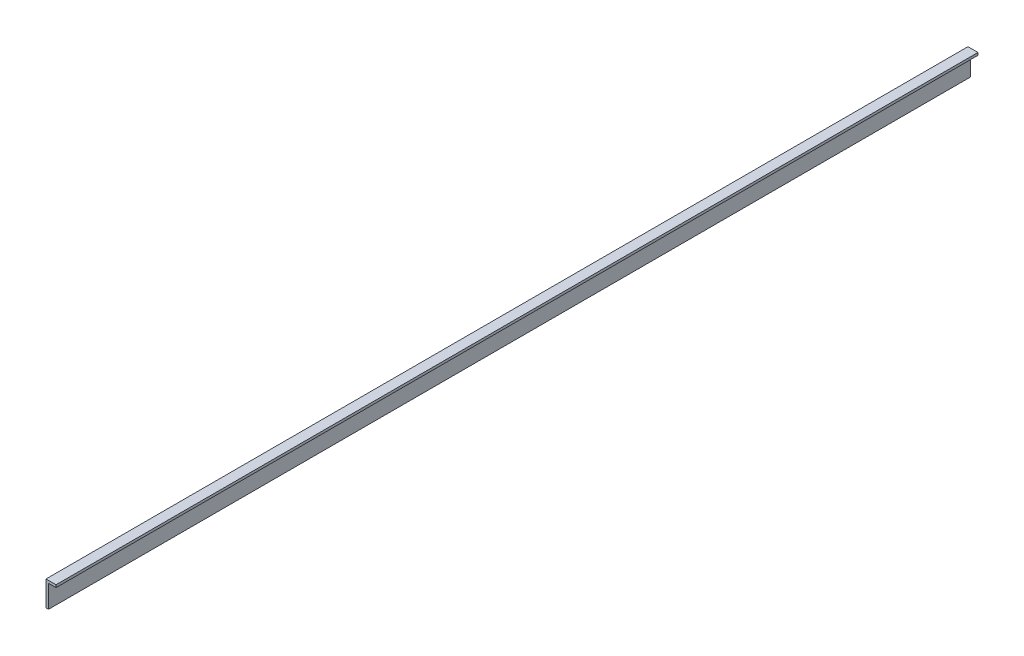
ISO-10303-21;
HEADER;
FILE_DESCRIPTION(('STEP AP214'),'2;1');
FILE_NAME('part.step','',(''),(''),'','','');
FILE_SCHEMA(('AUTOMOTIVE_DESIGN { 1 0 10303 214 1 1 1 1 }'));
ENDSEC;
DATA;
#1=APPLICATION_CONTEXT('core data for automotive mechanical design processes');
#2=APPLICATION_PROTOCOL_DEFINITION('international standard','automotive_design',2000,#1);
#3=PRODUCT_CONTEXT('',#1,'mechanical');
#4=PRODUCT('Part','Part','',(#3));
#5=PRODUCT_RELATED_PRODUCT_CATEGORY('part','',(#4));
#6=PRODUCT_DEFINITION_FORMATION('','',#4);
#7=PRODUCT_DEFINITION_CONTEXT('part definition',#1,'design');
#8=PRODUCT_DEFINITION('design','',#6,#7);
#9=PRODUCT_DEFINITION_SHAPE('','',#8);
#10=(LENGTH_UNIT() NAMED_UNIT(*) SI_UNIT(.MILLI.,.METRE.));
#11=(NAMED_UNIT(*) PLANE_ANGLE_UNIT() SI_UNIT($,.RADIAN.));
#12=(NAMED_UNIT(*) SI_UNIT($,.STERADIAN.) SOLID_ANGLE_UNIT());
#13=UNCERTAINTY_MEASURE_WITH_UNIT(LENGTH_MEASURE(1.E-05),#10,'distance_accuracy_value','');
#14=(GEOMETRIC_REPRESENTATION_CONTEXT(3) GLOBAL_UNCERTAINTY_ASSIGNED_CONTEXT((#13)) GLOBAL_UNIT_ASSIGNED_CONTEXT((#10,
#11,#12)) REPRESENTATION_CONTEXT('',''));
#15=CARTESIAN_POINT('',(0.,0.,0.));
#16=DIRECTION('',(0.,0.,1.));
#17=DIRECTION('',(1.,0.,0.));
#18=AXIS2_PLACEMENT_3D('',#15,#16,#17);
#19=CARTESIAN_POINT('',(245.5,422.5,-755.5));
#20=DIRECTION('',(1.,0.,0.));
#21=DIRECTION('',(0.,0.,-1.));
#22=AXIS2_PLACEMENT_3D('',#19,#20,#21);
#23=PLANE('',#22);
#24=DIRECTION('',(0.,1.,0.));
#25=VECTOR('',#24,1.);
#26=CARTESIAN_POINT('',(245.5,422.5,-20.));
#27=LINE('',#26,#25);
#28=CARTESIAN_POINT('',(245.5,404.5,-20.));
#29=VERTEX_POINT('',#28);
#30=CARTESIAN_POINT('',(245.5,422.5,-20.));
#31=VERTEX_POINT('',#30);
#32=EDGE_CURVE('E124',#29,#31,#27,.T.);
#33=ORIENTED_EDGE('',*,*,#32,.F.);
#34=DIRECTION('',(0.,0.,1.));
#35=VECTOR('',#34,1.);
#36=CARTESIAN_POINT('',(245.5,404.5,-755.5));
#37=LINE('',#36,#35);
#38=CARTESIAN_POINT('',(245.5,404.5,-755.5));
#39=VERTEX_POINT('',#38);
#40=EDGE_CURVE('E11',#39,#29,#37,.T.);
#41=ORIENTED_EDGE('',*,*,#40,.F.);
#42=DIRECTION('',(0.,1.,0.));
#43=VECTOR('',#42,1.);
#44=CARTESIAN_POINT('',(245.5,422.5,-755.5));
#45=LINE('',#44,#43);
#46=CARTESIAN_POINT('',(245.5,422.5,-755.5));
#47=VERTEX_POINT('',#46);
#48=EDGE_CURVE('E138',#39,#47,#45,.T.);
#49=ORIENTED_EDGE('',*,*,#48,.T.);
#50=DIRECTION('',(0.,0.,1.));
#51=VECTOR('',#50,1.);
#52=CARTESIAN_POINT('',(245.5,422.5,-755.5));
#53=LINE('',#52,#51);
#54=EDGE_CURVE('E42',#47,#31,#53,.T.);
#55=ORIENTED_EDGE('',*,*,#54,.T.);
#56=EDGE_LOOP('',(#33,#41,#49,#55));
#57=FACE_BOUND('',#56,.T.);
#58=ADVANCED_FACE('F39',(#57),#23,.T.);
#59=CARTESIAN_POINT('',(245.5,404.5,-755.5));
#60=DIRECTION('',(0.,-1.,0.));
#61=DIRECTION('',(0.,0.,-1.));
#62=AXIS2_PLACEMENT_3D('',#59,#60,#61);
#63=PLANE('',#62);
#64=DIRECTION('',(1.,0.,0.));
#65=VECTOR('',#64,1.);
#66=CARTESIAN_POINT('',(245.5,404.5,-20.));
#67=LINE('',#66,#65);
#68=CARTESIAN_POINT('',(243.5,404.5,-20.));
#69=VERTEX_POINT('',#68);
#70=EDGE_CURVE('E136',#69,#29,#67,.T.);
#71=ORIENTED_EDGE('',*,*,#70,.F.);
#72=DIRECTION('',(0.,0.,1.));
#73=VECTOR('',#72,1.);
#74=CARTESIAN_POINT('',(243.5,404.5,-755.5));
#75=LINE('',#74,#73);
#76=CARTESIAN_POINT('',(243.5,404.5,-755.5));
#77=VERTEX_POINT('',#76);
#78=EDGE_CURVE('E48',#77,#69,#75,.T.);
#79=ORIENTED_EDGE('',*,*,#78,.F.);
#80=DIRECTION('',(1.,0.,0.));
#81=VECTOR('',#80,1.);
#82=CARTESIAN_POINT('',(245.5,404.5,-755.5));
#83=LINE('',#82,#81);
#84=EDGE_CURVE('E114',#77,#39,#83,.T.);
#85=ORIENTED_EDGE('',*,*,#84,.T.);
#86=ORIENTED_EDGE('',*,*,#40,.T.);
#87=EDGE_LOOP('',(#71,#79,#85,#86));
#88=FACE_BOUND('',#87,.T.);
#89=ADVANCED_FACE('F146',(#88),#63,.T.);
#90=CARTESIAN_POINT('',(243.5,404.5,-755.5));
#91=DIRECTION('',(-1.,0.,0.));
#92=DIRECTION('',(0.,0.,1.));
#93=AXIS2_PLACEMENT_3D('',#90,#91,#92);
#94=PLANE('',#93);
#95=DIRECTION('',(0.,-1.,0.));
#96=VECTOR('',#95,1.);
#97=CARTESIAN_POINT('',(243.5,404.5,-20.));
#98=LINE('',#97,#96);
#99=CARTESIAN_POINT('',(243.5,424.5,-20.));
#100=VERTEX_POINT('',#99);
#101=EDGE_CURVE('E101',#100,#69,#98,.T.);
#102=ORIENTED_EDGE('',*,*,#101,.F.);
#103=DIRECTION('',(0.,0.,1.));
#104=VECTOR('',#103,1.);
#105=CARTESIAN_POINT('',(243.5,424.5,-755.5));
#106=LINE('',#105,#104);
#107=CARTESIAN_POINT('',(243.5,424.5,-755.5));
#108=VERTEX_POINT('',#107);
#109=EDGE_CURVE('E96',#108,#100,#106,.T.);
#110=ORIENTED_EDGE('',*,*,#109,.F.);
#111=DIRECTION('',(0.,-1.,0.));
#112=VECTOR('',#111,1.);
#113=CARTESIAN_POINT('',(243.5,404.5,-755.5));
#114=LINE('',#113,#112);
#115=EDGE_CURVE('E99',#108,#77,#114,.T.);
#116=ORIENTED_EDGE('',*,*,#115,.T.);
#117=ORIENTED_EDGE('',*,*,#78,.T.);
#118=EDGE_LOOP('',(#102,#110,#116,#117));
#119=FACE_BOUND('',#118,.T.);
#120=ADVANCED_FACE('F98',(#119),#94,.T.);
#121=CARTESIAN_POINT('',(243.5,424.5,-755.5));
#122=DIRECTION('',(0.,1.,0.));
#123=DIRECTION('',(0.,0.,1.));
#124=AXIS2_PLACEMENT_3D('',#121,#122,#123);
#125=PLANE('',#124);
#126=DIRECTION('',(-1.,0.,0.));
#127=VECTOR('',#126,1.);
#128=CARTESIAN_POINT('',(243.5,424.5,-20.));
#129=LINE('',#128,#127);
#130=CARTESIAN_POINT('',(251.5,424.5,-20.));
#131=VERTEX_POINT('',#130);
#132=EDGE_CURVE('E133',#131,#100,#129,.T.);
#133=ORIENTED_EDGE('',*,*,#132,.F.);
#134=DIRECTION('',(0.,0.,1.));
#135=VECTOR('',#134,1.);
#136=CARTESIAN_POINT('',(251.5,424.5,-755.5));
#137=LINE('',#136,#135);
#138=CARTESIAN_POINT('',(251.5,424.5,-755.5));
#139=VERTEX_POINT('',#138);
#140=EDGE_CURVE('E106',#139,#131,#137,.T.);
#141=ORIENTED_EDGE('',*,*,#140,.F.);
#142=DIRECTION('',(-1.,0.,0.));
#143=VECTOR('',#142,1.);
#144=CARTESIAN_POINT('',(243.5,424.5,-755.5));
#145=LINE('',#144,#143);
#146=EDGE_CURVE('E112',#139,#108,#145,.T.);
#147=ORIENTED_EDGE('',*,*,#146,.T.);
#148=ORIENTED_EDGE('',*,*,#109,.T.);
#149=EDGE_LOOP('',(#133,#141,#147,#148));
#150=FACE_BOUND('',#149,.T.);
#151=ADVANCED_FACE('F116',(#150),#125,.T.);
#152=CARTESIAN_POINT('',(251.5,424.5,-755.5));
#153=DIRECTION('',(1.,0.,0.));
#154=DIRECTION('',(0.,0.,-1.));
#155=AXIS2_PLACEMENT_3D('',#152,#153,#154);
#156=PLANE('',#155);
#157=DIRECTION('',(0.,1.,0.));
#158=VECTOR('',#157,1.);
#159=CARTESIAN_POINT('',(251.5,424.5,-20.));
#160=LINE('',#159,#158);
#161=CARTESIAN_POINT('',(251.5,422.5,-20.));
#162=VERTEX_POINT('',#161);
#163=EDGE_CURVE('E130',#162,#131,#160,.T.);
#164=ORIENTED_EDGE('',*,*,#163,.F.);
#165=DIRECTION('',(0.,0.,1.));
#166=VECTOR('',#165,1.);
#167=CARTESIAN_POINT('',(251.5,422.5,-755.5));
#168=LINE('',#167,#166);
#169=CARTESIAN_POINT('',(251.5,422.5,-755.5));
#170=VERTEX_POINT('',#169);
#171=EDGE_CURVE('E141',#170,#162,#168,.T.);
#172=ORIENTED_EDGE('',*,*,#171,.F.);
#173=DIRECTION('',(0.,1.,0.));
#174=VECTOR('',#173,1.);
#175=CARTESIAN_POINT('',(251.5,424.5,-755.5));
#176=LINE('',#175,#174);
#177=EDGE_CURVE('E117',#170,#139,#176,.T.);
#178=ORIENTED_EDGE('',*,*,#177,.T.);
#179=ORIENTED_EDGE('',*,*,#140,.T.);
#180=EDGE_LOOP('',(#164,#172,#178,#179));
#181=FACE_BOUND('',#180,.T.);
#182=ADVANCED_FACE('F159',(#181),#156,.T.);
#183=CARTESIAN_POINT('',(251.5,422.5,-755.5));
#184=DIRECTION('',(0.,-1.,0.));
#185=DIRECTION('',(0.,0.,-1.));
#186=AXIS2_PLACEMENT_3D('',#183,#184,#185);
#187=PLANE('',#186);
#188=DIRECTION('',(1.,0.,0.));
#189=VECTOR('',#188,1.);
#190=CARTESIAN_POINT('',(251.5,422.5,-20.));
#191=LINE('',#190,#189);
#192=EDGE_CURVE('E127',#31,#162,#191,.T.);
#193=ORIENTED_EDGE('',*,*,#192,.F.);
#194=ORIENTED_EDGE('',*,*,#54,.F.);
#195=DIRECTION('',(1.,0.,0.));
#196=VECTOR('',#195,1.);
#197=CARTESIAN_POINT('',(251.5,422.5,-755.5));
#198=LINE('',#197,#196);
#199=EDGE_CURVE('E119',#47,#170,#198,.T.);
#200=ORIENTED_EDGE('',*,*,#199,.T.);
#201=ORIENTED_EDGE('',*,*,#171,.T.);
#202=EDGE_LOOP('',(#193,#194,#200,#201));
#203=FACE_BOUND('',#202,.T.);
#204=ADVANCED_FACE('F143',(#203),#187,.T.);
#205=CARTESIAN_POINT('',(0.,0.,-755.5));
#206=DIRECTION('',(0.,0.,-1.));
#207=DIRECTION('',(-1.,0.,0.));
#208=AXIS2_PLACEMENT_3D('',#205,#206,#207);
#209=PLANE('',#208);
#210=ORIENTED_EDGE('',*,*,#48,.F.);
#211=ORIENTED_EDGE('',*,*,#84,.F.);
#212=ORIENTED_EDGE('',*,*,#115,.F.);
#213=ORIENTED_EDGE('',*,*,#146,.F.);
#214=ORIENTED_EDGE('',*,*,#177,.F.);
#215=ORIENTED_EDGE('',*,*,#199,.F.);
#216=EDGE_LOOP('',(#210,#211,#212,#213,#214,#215));
#217=FACE_BOUND('',#216,.T.);
#218=ADVANCED_FACE('F110',(#217),#209,.T.);
#219=CARTESIAN_POINT('',(0.,0.,-20.));
#220=DIRECTION('',(0.,0.,-1.));
#221=DIRECTION('',(-1.,0.,0.));
#222=AXIS2_PLACEMENT_3D('',#219,#220,#221);
#223=PLANE('',#222);
#224=ORIENTED_EDGE('',*,*,#32,.T.);
#225=ORIENTED_EDGE('',*,*,#192,.T.);
#226=ORIENTED_EDGE('',*,*,#163,.T.);
#227=ORIENTED_EDGE('',*,*,#132,.T.);
#228=ORIENTED_EDGE('',*,*,#101,.T.);
#229=ORIENTED_EDGE('',*,*,#70,.T.);
#230=EDGE_LOOP('',(#224,#225,#226,#227,#228,#229));
#231=FACE_BOUND('',#230,.T.);
#232=ADVANCED_FACE('F145',(#231),#223,.F.);
#233=CLOSED_SHELL('',(#58,#89,#120,#151,#182,#204,#218,#232));
#234=MANIFOLD_SOLID_BREP('B2',#233);
#235=ADVANCED_BREP_SHAPE_REPRESENTATION('',(#18,#234),#14);
#236=SHAPE_DEFINITION_REPRESENTATION(#9,#235);
ENDSEC;
END-ISO-10303-21;
